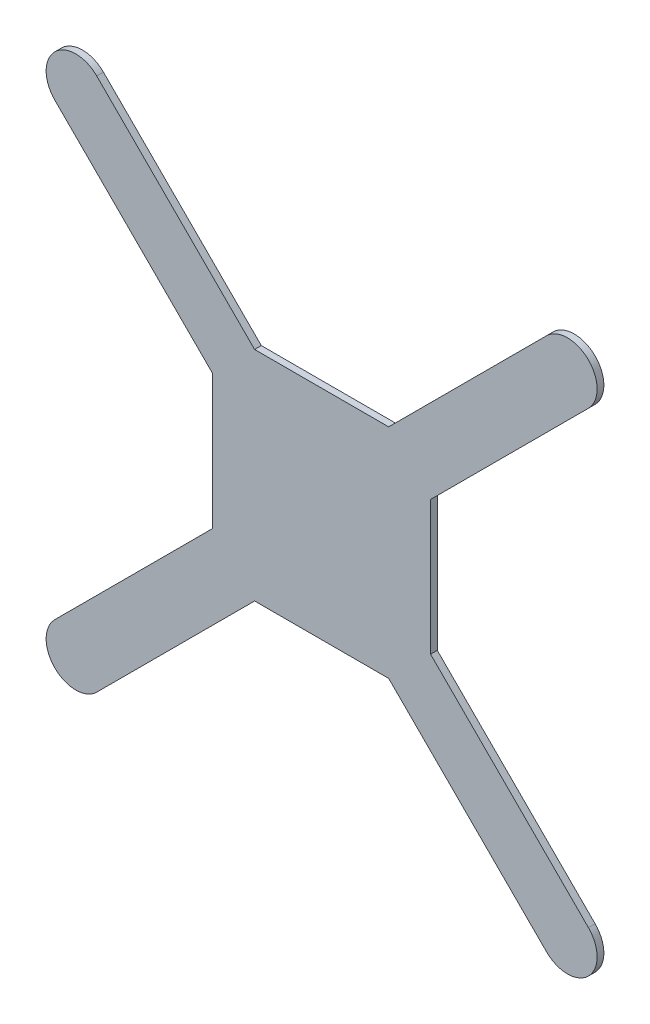
ISO-10303-21;
HEADER;
FILE_DESCRIPTION(('STEP AP214'),'2;1');
FILE_NAME('part.step','',(''),(''),'','','');
FILE_SCHEMA(('AUTOMOTIVE_DESIGN { 1 0 10303 214 1 1 1 1 }'));
ENDSEC;
DATA;
#1=APPLICATION_CONTEXT('core data for automotive mechanical design processes');
#2=APPLICATION_PROTOCOL_DEFINITION('international standard','automotive_design',2000,#1);
#3=PRODUCT_CONTEXT('',#1,'mechanical');
#4=PRODUCT('Part','Part','',(#3));
#5=PRODUCT_RELATED_PRODUCT_CATEGORY('part','',(#4));
#6=PRODUCT_DEFINITION_FORMATION('','',#4);
#7=PRODUCT_DEFINITION_CONTEXT('part definition',#1,'design');
#8=PRODUCT_DEFINITION('design','',#6,#7);
#9=PRODUCT_DEFINITION_SHAPE('','',#8);
#10=(LENGTH_UNIT() NAMED_UNIT(*) SI_UNIT(.MILLI.,.METRE.));
#11=(NAMED_UNIT(*) PLANE_ANGLE_UNIT() SI_UNIT($,.RADIAN.));
#12=(NAMED_UNIT(*) SI_UNIT($,.STERADIAN.) SOLID_ANGLE_UNIT());
#13=UNCERTAINTY_MEASURE_WITH_UNIT(LENGTH_MEASURE(1.E-05),#10,'distance_accuracy_value','');
#14=(GEOMETRIC_REPRESENTATION_CONTEXT(3) GLOBAL_UNCERTAINTY_ASSIGNED_CONTEXT((#13)) GLOBAL_UNIT_ASSIGNED_CONTEXT((#10,
#11,#12)) REPRESENTATION_CONTEXT('',''));
#15=CARTESIAN_POINT('',(0.,0.,0.));
#16=DIRECTION('',(0.,0.,1.));
#17=DIRECTION('',(1.,0.,0.));
#18=AXIS2_PLACEMENT_3D('',#15,#16,#17);
#19=CARTESIAN_POINT('',(-146.724657096209,-146.724657096208,4.));
#20=DIRECTION('',(0.,0.,-1.));
#21=DIRECTION('',(-1.,0.,0.));
#22=AXIS2_PLACEMENT_3D('',#19,#20,#21);
#23=CYLINDRICAL_SURFACE('',#22,17.6776695296638);
#24=CARTESIAN_POINT('',(-146.724657096209,-146.724657096208,0.));
#25=DIRECTION('',(0.,0.,1.));
#26=DIRECTION('',(1.,0.,0.));
#27=AXIS2_PLACEMENT_3D('',#24,#25,#26);
#28=CIRCLE('',#27,17.6776695296638);
#29=CARTESIAN_POINT('',(-134.224657096209,-159.224657096208,0.));
#30=VERTEX_POINT('',#29);
#31=CARTESIAN_POINT('',(-159.224657096209,-134.224657096208,0.));
#32=VERTEX_POINT('',#31);
#33=EDGE_CURVE('E182',#30,#32,#28,.F.);
#34=ORIENTED_EDGE('',*,*,#33,.F.);
#35=DIRECTION('',(0.,0.,-1.));
#36=VECTOR('',#35,1.);
#37=CARTESIAN_POINT('',(-134.224657096209,-159.224657096208,4.));
#38=LINE('',#37,#36);
#39=CARTESIAN_POINT('',(-134.224657096209,-159.224657096208,4.));
#40=VERTEX_POINT('',#39);
#41=EDGE_CURVE('E11',#40,#30,#38,.T.);
#42=ORIENTED_EDGE('',*,*,#41,.F.);
#43=CARTESIAN_POINT('',(-146.724657096209,-146.724657096208,4.));
#44=DIRECTION('',(0.,0.,1.));
#45=DIRECTION('',(1.,0.,0.));
#46=AXIS2_PLACEMENT_3D('',#43,#44,#45);
#47=CIRCLE('',#46,17.6776695296638);
#48=CARTESIAN_POINT('',(-159.224657096209,-134.224657096208,4.));
#49=VERTEX_POINT('',#48);
#50=EDGE_CURVE('E222',#40,#49,#47,.F.);
#51=ORIENTED_EDGE('',*,*,#50,.T.);
#52=DIRECTION('',(0.,0.,-1.));
#53=VECTOR('',#52,1.);
#54=CARTESIAN_POINT('',(-159.224657096209,-134.224657096208,4.));
#55=LINE('',#54,#53);
#56=EDGE_CURVE('E115',#49,#32,#55,.T.);
#57=ORIENTED_EDGE('',*,*,#56,.T.);
#58=EDGE_LOOP('',(#34,#42,#51,#57));
#59=FACE_BOUND('',#58,.T.);
#60=ADVANCED_FACE('F41',(#59),#23,.T.);
#61=CARTESIAN_POINT('',(12.5000000000001,-12.5000000000001,4.));
#62=DIRECTION('',(0.707106781186545,-0.70710678118655,0.));
#63=DIRECTION('',(0.70710678118655,0.707106781186545,0.));
#64=AXIS2_PLACEMENT_3D('',#61,#62,#63);
#65=PLANE('',#64);
#66=DIRECTION('',(-0.70710678118655,-0.707106781186545,0.));
#67=VECTOR('',#66,1.);
#68=CARTESIAN_POINT('',(12.5000000000001,-12.5000000000001,0.));
#69=LINE('',#68,#67);
#70=CARTESIAN_POINT('',(-40.,-64.9999999999999,0.));
#71=VERTEX_POINT('',#70);
#72=EDGE_CURVE('E185',#71,#30,#69,.T.);
#73=ORIENTED_EDGE('',*,*,#72,.F.);
#74=DIRECTION('',(0.,0.,-1.));
#75=VECTOR('',#74,1.);
#76=CARTESIAN_POINT('',(-40.,-64.9999999999999,4.));
#77=LINE('',#76,#75);
#78=CARTESIAN_POINT('',(-40.,-64.9999999999999,4.));
#79=VERTEX_POINT('',#78);
#80=EDGE_CURVE('E49',#79,#71,#77,.T.);
#81=ORIENTED_EDGE('',*,*,#80,.F.);
#82=DIRECTION('',(-0.70710678118655,-0.707106781186545,0.));
#83=VECTOR('',#82,1.);
#84=CARTESIAN_POINT('',(12.5000000000001,-12.5000000000001,4.));
#85=LINE('',#84,#83);
#86=EDGE_CURVE('E263',#79,#40,#85,.T.);
#87=ORIENTED_EDGE('',*,*,#86,.T.);
#88=ORIENTED_EDGE('',*,*,#41,.T.);
#89=EDGE_LOOP('',(#73,#81,#87,#88));
#90=FACE_BOUND('',#89,.T.);
#91=ADVANCED_FACE('F262',(#90),#65,.T.);
#92=CARTESIAN_POINT('',(0.,-64.9999999999999,4.));
#93=DIRECTION('',(0.,1.,0.));
#94=DIRECTION('',(-1.,0.,0.));
#95=AXIS2_PLACEMENT_3D('',#92,#93,#94);
#96=PLANE('',#95);
#97=DIRECTION('',(1.,0.,0.));
#98=VECTOR('',#97,1.);
#99=CARTESIAN_POINT('',(0.,-64.9999999999999,0.));
#100=LINE('',#99,#98);
#101=CARTESIAN_POINT('',(39.9999999999999,-64.9999999999999,0.));
#102=VERTEX_POINT('',#101);
#103=EDGE_CURVE('E188',#71,#102,#100,.T.);
#104=ORIENTED_EDGE('',*,*,#103,.T.);
#105=DIRECTION('',(0.,0.,-1.));
#106=VECTOR('',#105,1.);
#107=CARTESIAN_POINT('',(39.9999999999999,-64.9999999999999,4.));
#108=LINE('',#107,#106);
#109=CARTESIAN_POINT('',(39.9999999999999,-64.9999999999999,4.));
#110=VERTEX_POINT('',#109);
#111=EDGE_CURVE('E246',#110,#102,#108,.T.);
#112=ORIENTED_EDGE('',*,*,#111,.F.);
#113=DIRECTION('',(1.,0.,0.));
#114=VECTOR('',#113,1.);
#115=CARTESIAN_POINT('',(0.,-64.9999999999999,4.));
#116=LINE('',#115,#114);
#117=EDGE_CURVE('E253',#79,#110,#116,.T.);
#118=ORIENTED_EDGE('',*,*,#117,.F.);
#119=ORIENTED_EDGE('',*,*,#80,.T.);
#120=EDGE_LOOP('',(#104,#112,#118,#119));
#121=FACE_BOUND('',#120,.T.);
#122=ADVANCED_FACE('F251',(#121),#96,.F.);
#123=CARTESIAN_POINT('',(-12.5000000000002,-12.5000000000003,4.));
#124=DIRECTION('',(0.707106781186544,0.707106781186551,0.));
#125=DIRECTION('',(-0.707106781186551,0.707106781186544,0.));
#126=AXIS2_PLACEMENT_3D('',#123,#124,#125);
#127=PLANE('',#126);
#128=DIRECTION('',(0.707106781186551,-0.707106781186544,0.));
#129=VECTOR('',#128,1.);
#130=CARTESIAN_POINT('',(-12.5000000000002,-12.5000000000003,0.));
#131=LINE('',#130,#129);
#132=CARTESIAN_POINT('',(134.224657096209,-159.224657096208,0.));
#133=VERTEX_POINT('',#132);
#134=EDGE_CURVE('E190',#102,#133,#131,.T.);
#135=ORIENTED_EDGE('',*,*,#134,.T.);
#136=DIRECTION('',(0.,0.,-1.));
#137=VECTOR('',#136,1.);
#138=CARTESIAN_POINT('',(134.224657096209,-159.224657096208,4.));
#139=LINE('',#138,#137);
#140=CARTESIAN_POINT('',(134.224657096209,-159.224657096208,4.));
#141=VERTEX_POINT('',#140);
#142=EDGE_CURVE('E243',#141,#133,#139,.T.);
#143=ORIENTED_EDGE('',*,*,#142,.F.);
#144=DIRECTION('',(0.707106781186551,-0.707106781186544,0.));
#145=VECTOR('',#144,1.);
#146=CARTESIAN_POINT('',(-12.5000000000002,-12.5000000000003,4.));
#147=LINE('',#146,#145);
#148=EDGE_CURVE('E271',#110,#141,#147,.T.);
#149=ORIENTED_EDGE('',*,*,#148,.F.);
#150=ORIENTED_EDGE('',*,*,#111,.T.);
#151=EDGE_LOOP('',(#135,#143,#149,#150));
#152=FACE_BOUND('',#151,.T.);
#153=ADVANCED_FACE('F331',(#152),#127,.F.);
#154=CARTESIAN_POINT('',(146.724657096209,-146.724657096208,4.));
#155=DIRECTION('',(0.,0.,-1.));
#156=DIRECTION('',(-1.,0.,0.));
#157=AXIS2_PLACEMENT_3D('',#154,#155,#156);
#158=CYLINDRICAL_SURFACE('',#157,17.6776695296637);
#159=CARTESIAN_POINT('',(146.724657096209,-146.724657096208,0.));
#160=DIRECTION('',(0.,0.,1.));
#161=DIRECTION('',(1.,0.,0.));
#162=AXIS2_PLACEMENT_3D('',#159,#160,#161);
#163=CIRCLE('',#162,17.6776695296637);
#164=CARTESIAN_POINT('',(159.224657096209,-134.224657096208,0.));
#165=VERTEX_POINT('',#164);
#166=EDGE_CURVE('E192',#133,#165,#163,.T.);
#167=ORIENTED_EDGE('',*,*,#166,.T.);
#168=DIRECTION('',(0.,0.,-1.));
#169=VECTOR('',#168,1.);
#170=CARTESIAN_POINT('',(159.224657096209,-134.224657096208,4.));
#171=LINE('',#170,#169);
#172=CARTESIAN_POINT('',(159.224657096209,-134.224657096208,4.));
#173=VERTEX_POINT('',#172);
#174=EDGE_CURVE('E241',#173,#165,#171,.T.);
#175=ORIENTED_EDGE('',*,*,#174,.F.);
#176=CARTESIAN_POINT('',(146.724657096209,-146.724657096208,4.));
#177=DIRECTION('',(0.,0.,1.));
#178=DIRECTION('',(1.,0.,0.));
#179=AXIS2_PLACEMENT_3D('',#176,#177,#178);
#180=CIRCLE('',#179,17.6776695296637);
#181=EDGE_CURVE('E273',#141,#173,#180,.T.);
#182=ORIENTED_EDGE('',*,*,#181,.F.);
#183=ORIENTED_EDGE('',*,*,#142,.T.);
#184=EDGE_LOOP('',(#167,#175,#182,#183));
#185=FACE_BOUND('',#184,.T.);
#186=ADVANCED_FACE('F327',(#185),#158,.T.);
#187=CARTESIAN_POINT('',(12.4999999999998,12.4999999999999,4.));
#188=DIRECTION('',(0.707106781186545,0.70710678118655,0.));
#189=DIRECTION('',(-0.70710678118655,0.707106781186545,0.));
#190=AXIS2_PLACEMENT_3D('',#187,#188,#189);
#191=PLANE('',#190);
#192=DIRECTION('',(0.70710678118655,-0.707106781186545,0.));
#193=VECTOR('',#192,1.);
#194=CARTESIAN_POINT('',(12.4999999999998,12.4999999999999,0.));
#195=LINE('',#194,#193);
#196=CARTESIAN_POINT('',(65.,-39.9999999999999,0.));
#197=VERTEX_POINT('',#196);
#198=EDGE_CURVE('E195',#197,#165,#195,.T.);
#199=ORIENTED_EDGE('',*,*,#198,.F.);
#200=DIRECTION('',(0.,0.,-1.));
#201=VECTOR('',#200,1.);
#202=CARTESIAN_POINT('',(65.,-39.9999999999999,4.));
#203=LINE('',#202,#201);
#204=CARTESIAN_POINT('',(65.,-39.9999999999999,4.));
#205=VERTEX_POINT('',#204);
#206=EDGE_CURVE('E239',#205,#197,#203,.T.);
#207=ORIENTED_EDGE('',*,*,#206,.F.);
#208=DIRECTION('',(0.70710678118655,-0.707106781186545,0.));
#209=VECTOR('',#208,1.);
#210=CARTESIAN_POINT('',(12.4999999999998,12.4999999999999,4.));
#211=LINE('',#210,#209);
#212=EDGE_CURVE('E275',#205,#173,#211,.T.);
#213=ORIENTED_EDGE('',*,*,#212,.T.);
#214=ORIENTED_EDGE('',*,*,#174,.T.);
#215=EDGE_LOOP('',(#199,#207,#213,#214));
#216=FACE_BOUND('',#215,.T.);
#217=ADVANCED_FACE('F322',(#216),#191,.T.);
#218=CARTESIAN_POINT('',(65.,0.,4.));
#219=DIRECTION('',(1.,0.,0.));
#220=DIRECTION('',(0.,1.,0.));
#221=AXIS2_PLACEMENT_3D('',#218,#219,#220);
#222=PLANE('',#221);
#223=DIRECTION('',(0.,-1.,0.));
#224=VECTOR('',#223,1.);
#225=CARTESIAN_POINT('',(65.,0.,0.));
#226=LINE('',#225,#224);
#227=CARTESIAN_POINT('',(65.,40.,0.));
#228=VERTEX_POINT('',#227);
#229=EDGE_CURVE('E198',#228,#197,#226,.T.);
#230=ORIENTED_EDGE('',*,*,#229,.F.);
#231=DIRECTION('',(0.,0.,-1.));
#232=VECTOR('',#231,1.);
#233=CARTESIAN_POINT('',(65.,40.,4.));
#234=LINE('',#233,#232);
#235=CARTESIAN_POINT('',(65.,40.,4.));
#236=VERTEX_POINT('',#235);
#237=EDGE_CURVE('E237',#236,#228,#234,.T.);
#238=ORIENTED_EDGE('',*,*,#237,.F.);
#239=DIRECTION('',(0.,-1.,0.));
#240=VECTOR('',#239,1.);
#241=CARTESIAN_POINT('',(65.,0.,4.));
#242=LINE('',#241,#240);
#243=EDGE_CURVE('E278',#236,#205,#242,.T.);
#244=ORIENTED_EDGE('',*,*,#243,.T.);
#245=ORIENTED_EDGE('',*,*,#206,.T.);
#246=EDGE_LOOP('',(#230,#238,#244,#245));
#247=FACE_BOUND('',#246,.T.);
#248=ADVANCED_FACE('F319',(#247),#222,.T.);
#249=CARTESIAN_POINT('',(12.4999999999997,-12.4999999999998,4.));
#250=DIRECTION('',(-0.707106781186544,0.707106781186551,0.));
#251=DIRECTION('',(-0.707106781186551,-0.707106781186544,0.));
#252=AXIS2_PLACEMENT_3D('',#249,#250,#251);
#253=PLANE('',#252);
#254=DIRECTION('',(0.707106781186551,0.707106781186544,0.));
#255=VECTOR('',#254,1.);
#256=CARTESIAN_POINT('',(12.4999999999997,-12.4999999999998,0.));
#257=LINE('',#256,#255);
#258=CARTESIAN_POINT('',(159.224657096209,134.224657096208,0.));
#259=VERTEX_POINT('',#258);
#260=EDGE_CURVE('E201',#228,#259,#257,.T.);
#261=ORIENTED_EDGE('',*,*,#260,.T.);
#262=DIRECTION('',(0.,0.,-1.));
#263=VECTOR('',#262,1.);
#264=CARTESIAN_POINT('',(159.224657096209,134.224657096208,4.));
#265=LINE('',#264,#263);
#266=CARTESIAN_POINT('',(159.224657096209,134.224657096208,4.));
#267=VERTEX_POINT('',#266);
#268=EDGE_CURVE('E235',#267,#259,#265,.T.);
#269=ORIENTED_EDGE('',*,*,#268,.F.);
#270=DIRECTION('',(0.707106781186551,0.707106781186544,0.));
#271=VECTOR('',#270,1.);
#272=CARTESIAN_POINT('',(12.4999999999997,-12.4999999999998,4.));
#273=LINE('',#272,#271);
#274=EDGE_CURVE('E281',#236,#267,#273,.T.);
#275=ORIENTED_EDGE('',*,*,#274,.F.);
#276=ORIENTED_EDGE('',*,*,#237,.T.);
#277=EDGE_LOOP('',(#261,#269,#275,#276));
#278=FACE_BOUND('',#277,.T.);
#279=ADVANCED_FACE('F316',(#278),#253,.F.);
#280=CARTESIAN_POINT('',(146.724657096209,146.724657096208,4.));
#281=DIRECTION('',(0.,0.,-1.));
#282=DIRECTION('',(-1.,0.,0.));
#283=AXIS2_PLACEMENT_3D('',#280,#281,#282);
#284=CYLINDRICAL_SURFACE('',#283,17.6776695296637);
#285=CARTESIAN_POINT('',(146.724657096209,146.724657096208,0.));
#286=DIRECTION('',(0.,0.,1.));
#287=DIRECTION('',(1.,0.,0.));
#288=AXIS2_PLACEMENT_3D('',#285,#286,#287);
#289=CIRCLE('',#288,17.6776695296637);
#290=CARTESIAN_POINT('',(134.224657096209,159.224657096208,0.));
#291=VERTEX_POINT('',#290);
#292=EDGE_CURVE('E204',#291,#259,#289,.F.);
#293=ORIENTED_EDGE('',*,*,#292,.F.);
#294=DIRECTION('',(0.,0.,-1.));
#295=VECTOR('',#294,1.);
#296=CARTESIAN_POINT('',(134.224657096209,159.224657096208,4.));
#297=LINE('',#296,#295);
#298=CARTESIAN_POINT('',(134.224657096209,159.224657096208,4.));
#299=VERTEX_POINT('',#298);
#300=EDGE_CURVE('E233',#299,#291,#297,.T.);
#301=ORIENTED_EDGE('',*,*,#300,.F.);
#302=CARTESIAN_POINT('',(146.724657096209,146.724657096208,4.));
#303=DIRECTION('',(0.,0.,1.));
#304=DIRECTION('',(1.,0.,0.));
#305=AXIS2_PLACEMENT_3D('',#302,#303,#304);
#306=CIRCLE('',#305,17.6776695296637);
#307=EDGE_CURVE('E283',#299,#267,#306,.F.);
#308=ORIENTED_EDGE('',*,*,#307,.T.);
#309=ORIENTED_EDGE('',*,*,#268,.T.);
#310=EDGE_LOOP('',(#293,#301,#308,#309));
#311=FACE_BOUND('',#310,.T.);
#312=ADVANCED_FACE('F311',(#311),#284,.T.);
#313=CARTESIAN_POINT('',(-12.5000000000002,12.5000000000003,4.));
#314=DIRECTION('',(-0.707106781186544,0.707106781186551,0.));
#315=DIRECTION('',(-0.707106781186551,-0.707106781186544,0.));
#316=AXIS2_PLACEMENT_3D('',#313,#314,#315);
#317=PLANE('',#316);
#318=DIRECTION('',(0.707106781186551,0.707106781186544,0.));
#319=VECTOR('',#318,1.);
#320=CARTESIAN_POINT('',(-12.5000000000002,12.5000000000003,0.));
#321=LINE('',#320,#319);
#322=CARTESIAN_POINT('',(40.,65.,0.));
#323=VERTEX_POINT('',#322);
#324=EDGE_CURVE('E207',#323,#291,#321,.T.);
#325=ORIENTED_EDGE('',*,*,#324,.F.);
#326=DIRECTION('',(0.,0.,-1.));
#327=VECTOR('',#326,1.);
#328=CARTESIAN_POINT('',(40.,65.,4.));
#329=LINE('',#328,#327);
#330=CARTESIAN_POINT('',(40.,65.,4.));
#331=VERTEX_POINT('',#330);
#332=EDGE_CURVE('E231',#331,#323,#329,.T.);
#333=ORIENTED_EDGE('',*,*,#332,.F.);
#334=DIRECTION('',(0.707106781186551,0.707106781186544,0.));
#335=VECTOR('',#334,1.);
#336=CARTESIAN_POINT('',(-12.5000000000002,12.5000000000003,4.));
#337=LINE('',#336,#335);
#338=EDGE_CURVE('E286',#331,#299,#337,.T.);
#339=ORIENTED_EDGE('',*,*,#338,.T.);
#340=ORIENTED_EDGE('',*,*,#300,.T.);
#341=EDGE_LOOP('',(#325,#333,#339,#340));
#342=FACE_BOUND('',#341,.T.);
#343=ADVANCED_FACE('F306',(#342),#317,.T.);
#344=CARTESIAN_POINT('',(0.,65.,4.));
#345=DIRECTION('',(0.,1.,0.));
#346=DIRECTION('',(-1.,0.,0.));
#347=AXIS2_PLACEMENT_3D('',#344,#345,#346);
#348=PLANE('',#347);
#349=DIRECTION('',(1.,0.,0.));
#350=VECTOR('',#349,1.);
#351=CARTESIAN_POINT('',(0.,65.,0.));
#352=LINE('',#351,#350);
#353=CARTESIAN_POINT('',(-40.,65.,0.));
#354=VERTEX_POINT('',#353);
#355=EDGE_CURVE('E210',#354,#323,#352,.T.);
#356=ORIENTED_EDGE('',*,*,#355,.F.);
#357=DIRECTION('',(0.,0.,-1.));
#358=VECTOR('',#357,1.);
#359=CARTESIAN_POINT('',(-40.,65.,4.));
#360=LINE('',#359,#358);
#361=CARTESIAN_POINT('',(-40.,65.,4.));
#362=VERTEX_POINT('',#361);
#363=EDGE_CURVE('E229',#362,#354,#360,.T.);
#364=ORIENTED_EDGE('',*,*,#363,.F.);
#365=DIRECTION('',(1.,0.,0.));
#366=VECTOR('',#365,1.);
#367=CARTESIAN_POINT('',(0.,65.,4.));
#368=LINE('',#367,#366);
#369=EDGE_CURVE('E289',#362,#331,#368,.T.);
#370=ORIENTED_EDGE('',*,*,#369,.T.);
#371=ORIENTED_EDGE('',*,*,#332,.T.);
#372=EDGE_LOOP('',(#356,#364,#370,#371));
#373=FACE_BOUND('',#372,.T.);
#374=ADVANCED_FACE('F303',(#373),#348,.T.);
#375=CARTESIAN_POINT('',(12.5000000000001,12.5000000000002,4.));
#376=DIRECTION('',(-0.707106781186545,-0.70710678118655,0.));
#377=DIRECTION('',(0.70710678118655,-0.707106781186545,0.));
#378=AXIS2_PLACEMENT_3D('',#375,#376,#377);
#379=PLANE('',#378);
#380=DIRECTION('',(-0.70710678118655,0.707106781186545,0.));
#381=VECTOR('',#380,1.);
#382=CARTESIAN_POINT('',(12.5000000000001,12.5000000000002,0.));
#383=LINE('',#382,#381);
#384=CARTESIAN_POINT('',(-134.224657096209,159.224657096208,0.));
#385=VERTEX_POINT('',#384);
#386=EDGE_CURVE('E213',#354,#385,#383,.T.);
#387=ORIENTED_EDGE('',*,*,#386,.T.);
#388=DIRECTION('',(0.,0.,-1.));
#389=VECTOR('',#388,1.);
#390=CARTESIAN_POINT('',(-134.224657096209,159.224657096208,4.));
#391=LINE('',#390,#389);
#392=CARTESIAN_POINT('',(-134.224657096209,159.224657096208,4.));
#393=VERTEX_POINT('',#392);
#394=EDGE_CURVE('E226',#393,#385,#391,.T.);
#395=ORIENTED_EDGE('',*,*,#394,.F.);
#396=DIRECTION('',(-0.70710678118655,0.707106781186545,0.));
#397=VECTOR('',#396,1.);
#398=CARTESIAN_POINT('',(12.5000000000001,12.5000000000002,4.));
#399=LINE('',#398,#397);
#400=EDGE_CURVE('E177',#362,#393,#399,.T.);
#401=ORIENTED_EDGE('',*,*,#400,.F.);
#402=ORIENTED_EDGE('',*,*,#363,.T.);
#403=EDGE_LOOP('',(#387,#395,#401,#402));
#404=FACE_BOUND('',#403,.T.);
#405=ADVANCED_FACE('F296',(#404),#379,.F.);
#406=CARTESIAN_POINT('',(-146.724657096209,146.724657096208,4.));
#407=DIRECTION('',(0.,0.,-1.));
#408=DIRECTION('',(-1.,0.,0.));
#409=AXIS2_PLACEMENT_3D('',#406,#407,#408);
#410=CYLINDRICAL_SURFACE('',#409,17.6776695296638);
#411=CARTESIAN_POINT('',(-146.724657096209,146.724657096208,0.));
#412=DIRECTION('',(0.,0.,1.));
#413=DIRECTION('',(1.,0.,0.));
#414=AXIS2_PLACEMENT_3D('',#411,#412,#413);
#415=CIRCLE('',#414,17.6776695296638);
#416=CARTESIAN_POINT('',(-159.224657096209,134.224657096208,0.));
#417=VERTEX_POINT('',#416);
#418=EDGE_CURVE('E215',#385,#417,#415,.T.);
#419=ORIENTED_EDGE('',*,*,#418,.T.);
#420=DIRECTION('',(0.,0.,-1.));
#421=VECTOR('',#420,1.);
#422=CARTESIAN_POINT('',(-159.224657096209,134.224657096208,4.));
#423=LINE('',#422,#421);
#424=CARTESIAN_POINT('',(-159.224657096209,134.224657096208,4.));
#425=VERTEX_POINT('',#424);
#426=EDGE_CURVE('E166',#425,#417,#423,.T.);
#427=ORIENTED_EDGE('',*,*,#426,.F.);
#428=CARTESIAN_POINT('',(-146.724657096209,146.724657096208,4.));
#429=DIRECTION('',(0.,0.,1.));
#430=DIRECTION('',(1.,0.,0.));
#431=AXIS2_PLACEMENT_3D('',#428,#429,#430);
#432=CIRCLE('',#431,17.6776695296638);
#433=EDGE_CURVE('E174',#393,#425,#432,.T.);
#434=ORIENTED_EDGE('',*,*,#433,.F.);
#435=ORIENTED_EDGE('',*,*,#394,.T.);
#436=EDGE_LOOP('',(#419,#427,#434,#435));
#437=FACE_BOUND('',#436,.T.);
#438=ADVANCED_FACE('F300',(#437),#410,.T.);
#439=CARTESIAN_POINT('',(-12.4999999999997,-12.4999999999998,4.));
#440=DIRECTION('',(-0.707106781186544,-0.707106781186551,0.));
#441=DIRECTION('',(0.707106781186551,-0.707106781186544,0.));
#442=AXIS2_PLACEMENT_3D('',#439,#440,#441);
#443=PLANE('',#442);
#444=DIRECTION('',(-0.707106781186551,0.707106781186544,0.));
#445=VECTOR('',#444,1.);
#446=CARTESIAN_POINT('',(-12.4999999999997,-12.4999999999998,0.));
#447=LINE('',#446,#445);
#448=CARTESIAN_POINT('',(-65.,40.,0.));
#449=VERTEX_POINT('',#448);
#450=EDGE_CURVE('E165',#449,#417,#447,.T.);
#451=ORIENTED_EDGE('',*,*,#450,.F.);
#452=DIRECTION('',(0.,0.,-1.));
#453=VECTOR('',#452,1.);
#454=CARTESIAN_POINT('',(-65.,40.,4.));
#455=LINE('',#454,#453);
#456=CARTESIAN_POINT('',(-65.,40.,4.));
#457=VERTEX_POINT('',#456);
#458=EDGE_CURVE('E159',#457,#449,#455,.T.);
#459=ORIENTED_EDGE('',*,*,#458,.F.);
#460=DIRECTION('',(-0.707106781186551,0.707106781186544,0.));
#461=VECTOR('',#460,1.);
#462=CARTESIAN_POINT('',(-12.4999999999997,-12.4999999999998,4.));
#463=LINE('',#462,#461);
#464=EDGE_CURVE('E163',#457,#425,#463,.T.);
#465=ORIENTED_EDGE('',*,*,#464,.T.);
#466=ORIENTED_EDGE('',*,*,#426,.T.);
#467=EDGE_LOOP('',(#451,#459,#465,#466));
#468=FACE_BOUND('',#467,.T.);
#469=ADVANCED_FACE('F161',(#468),#443,.T.);
#470=CARTESIAN_POINT('',(-65.,0.,4.));
#471=DIRECTION('',(1.,0.,0.));
#472=DIRECTION('',(0.,0.,-1.));
#473=AXIS2_PLACEMENT_3D('',#470,#471,#472);
#474=PLANE('',#473);
#475=DIRECTION('',(0.,-1.,0.));
#476=VECTOR('',#475,1.);
#477=CARTESIAN_POINT('',(-65.,0.,0.));
#478=LINE('',#477,#476);
#479=CARTESIAN_POINT('',(-65.,-40.,0.));
#480=VERTEX_POINT('',#479);
#481=EDGE_CURVE('E108',#449,#480,#478,.T.);
#482=ORIENTED_EDGE('',*,*,#481,.T.);
#483=DIRECTION('',(0.,0.,-1.));
#484=VECTOR('',#483,1.);
#485=CARTESIAN_POINT('',(-65.,-40.,4.));
#486=LINE('',#485,#484);
#487=CARTESIAN_POINT('',(-65.,-40.,4.));
#488=VERTEX_POINT('',#487);
#489=EDGE_CURVE('E167',#488,#480,#486,.T.);
#490=ORIENTED_EDGE('',*,*,#489,.F.);
#491=DIRECTION('',(0.,-1.,0.));
#492=VECTOR('',#491,1.);
#493=CARTESIAN_POINT('',(-65.,0.,4.));
#494=LINE('',#493,#492);
#495=EDGE_CURVE('E169',#457,#488,#494,.T.);
#496=ORIENTED_EDGE('',*,*,#495,.F.);
#497=ORIENTED_EDGE('',*,*,#458,.T.);
#498=EDGE_LOOP('',(#482,#490,#496,#497));
#499=FACE_BOUND('',#498,.T.);
#500=ADVANCED_FACE('F170',(#499),#474,.F.);
#501=CARTESIAN_POINT('',(-12.4999999999997,12.4999999999998,4.));
#502=DIRECTION('',(0.707106781186544,-0.707106781186551,0.));
#503=DIRECTION('',(0.707106781186551,0.707106781186544,0.));
#504=AXIS2_PLACEMENT_3D('',#501,#502,#503);
#505=PLANE('',#504);
#506=DIRECTION('',(-0.707106781186551,-0.707106781186544,0.));
#507=VECTOR('',#506,1.);
#508=CARTESIAN_POINT('',(-12.4999999999997,12.4999999999998,0.));
#509=LINE('',#508,#507);
#510=EDGE_CURVE('E220',#480,#32,#509,.T.);
#511=ORIENTED_EDGE('',*,*,#510,.T.);
#512=ORIENTED_EDGE('',*,*,#56,.F.);
#513=DIRECTION('',(-0.707106781186551,-0.707106781186544,0.));
#514=VECTOR('',#513,1.);
#515=CARTESIAN_POINT('',(-12.4999999999997,12.4999999999998,4.));
#516=LINE('',#515,#514);
#517=EDGE_CURVE('E57',#488,#49,#516,.T.);
#518=ORIENTED_EDGE('',*,*,#517,.F.);
#519=ORIENTED_EDGE('',*,*,#489,.T.);
#520=EDGE_LOOP('',(#511,#512,#518,#519));
#521=FACE_BOUND('',#520,.T.);
#522=ADVANCED_FACE('F266',(#521),#505,.F.);
#523=CARTESIAN_POINT('',(0.,0.,4.));
#524=DIRECTION('',(0.,0.,1.));
#525=DIRECTION('',(1.,0.,0.));
#526=AXIS2_PLACEMENT_3D('',#523,#524,#525);
#527=PLANE('',#526);
#528=ORIENTED_EDGE('',*,*,#50,.F.);
#529=ORIENTED_EDGE('',*,*,#86,.F.);
#530=ORIENTED_EDGE('',*,*,#117,.T.);
#531=ORIENTED_EDGE('',*,*,#148,.T.);
#532=ORIENTED_EDGE('',*,*,#181,.T.);
#533=ORIENTED_EDGE('',*,*,#212,.F.);
#534=ORIENTED_EDGE('',*,*,#243,.F.);
#535=ORIENTED_EDGE('',*,*,#274,.T.);
#536=ORIENTED_EDGE('',*,*,#307,.F.);
#537=ORIENTED_EDGE('',*,*,#338,.F.);
#538=ORIENTED_EDGE('',*,*,#369,.F.);
#539=ORIENTED_EDGE('',*,*,#400,.T.);
#540=ORIENTED_EDGE('',*,*,#433,.T.);
#541=ORIENTED_EDGE('',*,*,#464,.F.);
#542=ORIENTED_EDGE('',*,*,#495,.T.);
#543=ORIENTED_EDGE('',*,*,#517,.T.);
#544=EDGE_LOOP('',(#528,#529,#530,#531,#532,#533,#534,#535,#536,#537,#538,#539,#540,#541,#542,#543));
#545=FACE_BOUND('',#544,.T.);
#546=ADVANCED_FACE('F172',(#545),#527,.T.);
#547=CARTESIAN_POINT('',(0.,0.,0.));
#548=DIRECTION('',(0.,0.,1.));
#549=DIRECTION('',(1.,0.,0.));
#550=AXIS2_PLACEMENT_3D('',#547,#548,#549);
#551=PLANE('',#550);
#552=ORIENTED_EDGE('',*,*,#33,.T.);
#553=ORIENTED_EDGE('',*,*,#510,.F.);
#554=ORIENTED_EDGE('',*,*,#481,.F.);
#555=ORIENTED_EDGE('',*,*,#450,.T.);
#556=ORIENTED_EDGE('',*,*,#418,.F.);
#557=ORIENTED_EDGE('',*,*,#386,.F.);
#558=ORIENTED_EDGE('',*,*,#355,.T.);
#559=ORIENTED_EDGE('',*,*,#324,.T.);
#560=ORIENTED_EDGE('',*,*,#292,.T.);
#561=ORIENTED_EDGE('',*,*,#260,.F.);
#562=ORIENTED_EDGE('',*,*,#229,.T.);
#563=ORIENTED_EDGE('',*,*,#198,.T.);
#564=ORIENTED_EDGE('',*,*,#166,.F.);
#565=ORIENTED_EDGE('',*,*,#134,.F.);
#566=ORIENTED_EDGE('',*,*,#103,.F.);
#567=ORIENTED_EDGE('',*,*,#72,.T.);
#568=EDGE_LOOP('',(#552,#553,#554,#555,#556,#557,#558,#559,#560,#561,#562,#563,#564,#565,#566,#567));
#569=FACE_BOUND('',#568,.T.);
#570=ADVANCED_FACE('F260',(#569),#551,.F.);
#571=CLOSED_SHELL('',(#60,#91,#122,#153,#186,#217,#248,#279,#312,#343,#374,#405,#438,#469,#500,
#522,#546,#570));
#572=MANIFOLD_SOLID_BREP('B2',#571);
#573=ADVANCED_BREP_SHAPE_REPRESENTATION('',(#18,#572),#14);
#574=SHAPE_DEFINITION_REPRESENTATION(#9,#573);
ENDSEC;
END-ISO-10303-21;
